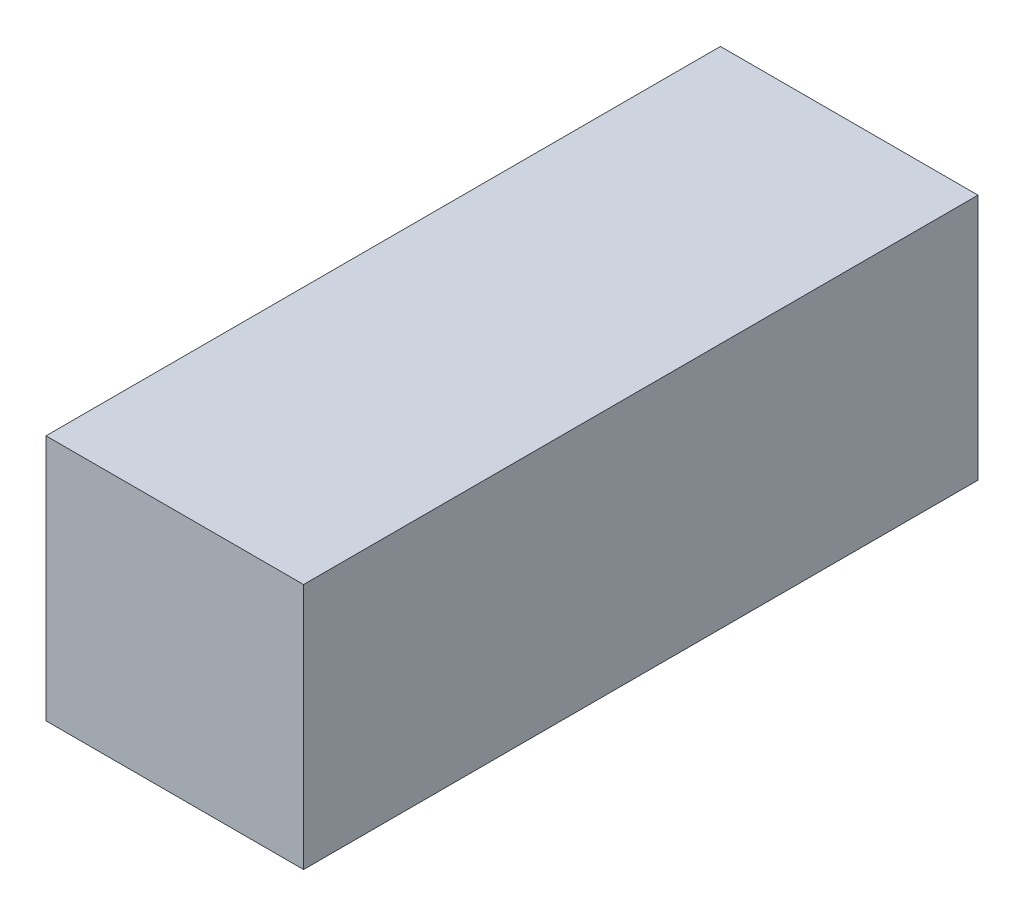
ISO-10303-21;
HEADER;
FILE_DESCRIPTION(('STEP AP214'),'2;1');
FILE_NAME('part.step','',(''),(''),'','','');
FILE_SCHEMA(('AUTOMOTIVE_DESIGN { 1 0 10303 214 1 1 1 1 }'));
ENDSEC;
DATA;
#1=APPLICATION_CONTEXT('core data for automotive mechanical design processes');
#2=APPLICATION_PROTOCOL_DEFINITION('international standard','automotive_design',2000,#1);
#3=PRODUCT_CONTEXT('',#1,'mechanical');
#4=PRODUCT('Part','Part','',(#3));
#5=PRODUCT_RELATED_PRODUCT_CATEGORY('part','',(#4));
#6=PRODUCT_DEFINITION_FORMATION('','',#4);
#7=PRODUCT_DEFINITION_CONTEXT('part definition',#1,'design');
#8=PRODUCT_DEFINITION('design','',#6,#7);
#9=PRODUCT_DEFINITION_SHAPE('','',#8);
#10=(LENGTH_UNIT() NAMED_UNIT(*) SI_UNIT(.MILLI.,.METRE.));
#11=(NAMED_UNIT(*) PLANE_ANGLE_UNIT() SI_UNIT($,.RADIAN.));
#12=(NAMED_UNIT(*) SI_UNIT($,.STERADIAN.) SOLID_ANGLE_UNIT());
#13=UNCERTAINTY_MEASURE_WITH_UNIT(LENGTH_MEASURE(1.E-05),#10,'distance_accuracy_value','');
#14=(GEOMETRIC_REPRESENTATION_CONTEXT(3) GLOBAL_UNCERTAINTY_ASSIGNED_CONTEXT((#13)) GLOBAL_UNIT_ASSIGNED_CONTEXT((#10,
#11,#12)) REPRESENTATION_CONTEXT('',''));
#15=CARTESIAN_POINT('',(0.,0.,0.));
#16=DIRECTION('',(0.,0.,1.));
#17=DIRECTION('',(1.,0.,0.));
#18=AXIS2_PLACEMENT_3D('',#15,#16,#17);
#19=CARTESIAN_POINT('',(1.212632322,-1.162130645,6.35));
#20=DIRECTION('',(-1.,0.,0.));
#21=DIRECTION('',(0.,0.,1.));
#22=AXIS2_PLACEMENT_3D('',#19,#20,#21);
#23=PLANE('',#22);
#24=DIRECTION('',(0.,1.,0.));
#25=VECTOR('',#24,1.);
#26=CARTESIAN_POINT('',(1.212632322,-1.162130645,0.));
#27=LINE('',#26,#25);
#28=CARTESIAN_POINT('',(1.212632322,-1.162130645,0.));
#29=VERTEX_POINT('',#28);
#30=CARTESIAN_POINT('',(1.212632322,1.162130645,0.));
#31=VERTEX_POINT('',#30);
#32=EDGE_CURVE('E94',#29,#31,#27,.T.);
#33=ORIENTED_EDGE('',*,*,#32,.T.);
#34=DIRECTION('',(0.,0.,-1.));
#35=VECTOR('',#34,1.);
#36=CARTESIAN_POINT('',(1.212632322,1.162130645,6.35));
#37=LINE('',#36,#35);
#38=CARTESIAN_POINT('',(1.212632322,1.162130645,6.35));
#39=VERTEX_POINT('',#38);
#40=EDGE_CURVE('E11',#39,#31,#37,.T.);
#41=ORIENTED_EDGE('',*,*,#40,.F.);
#42=DIRECTION('',(0.,1.,0.));
#43=VECTOR('',#42,1.);
#44=CARTESIAN_POINT('',(1.212632322,-1.162130645,6.35));
#45=LINE('',#44,#43);
#46=CARTESIAN_POINT('',(1.212632322,-1.162130645,6.35));
#47=VERTEX_POINT('',#46);
#48=EDGE_CURVE('E82',#47,#39,#45,.T.);
#49=ORIENTED_EDGE('',*,*,#48,.F.);
#50=DIRECTION('',(0.,0.,-1.));
#51=VECTOR('',#50,1.);
#52=CARTESIAN_POINT('',(1.212632322,-1.162130645,6.35));
#53=LINE('',#52,#51);
#54=EDGE_CURVE('E90',#47,#29,#53,.T.);
#55=ORIENTED_EDGE('',*,*,#54,.T.);
#56=EDGE_LOOP('',(#33,#41,#49,#55));
#57=FACE_BOUND('',#56,.T.);
#58=ADVANCED_FACE('F31',(#57),#23,.F.);
#59=CARTESIAN_POINT('',(-1.212632322,1.162130645,6.35));
#60=DIRECTION('',(0.,-1.,0.));
#61=DIRECTION('',(0.,0.,-1.));
#62=AXIS2_PLACEMENT_3D('',#59,#60,#61);
#63=PLANE('',#62);
#64=DIRECTION('',(-1.,0.,0.));
#65=VECTOR('',#64,1.);
#66=CARTESIAN_POINT('',(-1.212632322,1.162130645,0.));
#67=LINE('',#66,#65);
#68=CARTESIAN_POINT('',(-1.212632322,1.162130645,0.));
#69=VERTEX_POINT('',#68);
#70=EDGE_CURVE('E86',#31,#69,#67,.T.);
#71=ORIENTED_EDGE('',*,*,#70,.T.);
#72=DIRECTION('',(0.,0.,-1.));
#73=VECTOR('',#72,1.);
#74=CARTESIAN_POINT('',(-1.212632322,1.162130645,6.35));
#75=LINE('',#74,#73);
#76=CARTESIAN_POINT('',(-1.212632322,1.162130645,6.35));
#77=VERTEX_POINT('',#76);
#78=EDGE_CURVE('E39',#77,#69,#75,.T.);
#79=ORIENTED_EDGE('',*,*,#78,.F.);
#80=DIRECTION('',(-1.,0.,0.));
#81=VECTOR('',#80,1.);
#82=CARTESIAN_POINT('',(-1.212632322,1.162130645,6.35));
#83=LINE('',#82,#81);
#84=EDGE_CURVE('E77',#39,#77,#83,.T.);
#85=ORIENTED_EDGE('',*,*,#84,.F.);
#86=ORIENTED_EDGE('',*,*,#40,.T.);
#87=EDGE_LOOP('',(#71,#79,#85,#86));
#88=FACE_BOUND('',#87,.T.);
#89=ADVANCED_FACE('F85',(#88),#63,.F.);
#90=CARTESIAN_POINT('',(-1.212632322,-1.162130645,6.35));
#91=DIRECTION('',(1.,0.,0.));
#92=DIRECTION('',(0.,0.,-1.));
#93=AXIS2_PLACEMENT_3D('',#90,#91,#92);
#94=PLANE('',#93);
#95=DIRECTION('',(0.,-1.,0.));
#96=VECTOR('',#95,1.);
#97=CARTESIAN_POINT('',(-1.212632322,-1.162130645,0.));
#98=LINE('',#97,#96);
#99=CARTESIAN_POINT('',(-1.212632322,-1.162130645,0.));
#100=VERTEX_POINT('',#99);
#101=EDGE_CURVE('E64',#69,#100,#98,.T.);
#102=ORIENTED_EDGE('',*,*,#101,.T.);
#103=DIRECTION('',(0.,0.,-1.));
#104=VECTOR('',#103,1.);
#105=CARTESIAN_POINT('',(-1.212632322,-1.162130645,6.35));
#106=LINE('',#105,#104);
#107=CARTESIAN_POINT('',(-1.212632322,-1.162130645,6.35));
#108=VERTEX_POINT('',#107);
#109=EDGE_CURVE('E87',#108,#100,#106,.T.);
#110=ORIENTED_EDGE('',*,*,#109,.F.);
#111=DIRECTION('',(0.,-1.,0.));
#112=VECTOR('',#111,1.);
#113=CARTESIAN_POINT('',(-1.212632322,-1.162130645,6.35));
#114=LINE('',#113,#112);
#115=EDGE_CURVE('E80',#77,#108,#114,.T.);
#116=ORIENTED_EDGE('',*,*,#115,.F.);
#117=ORIENTED_EDGE('',*,*,#78,.T.);
#118=EDGE_LOOP('',(#102,#110,#116,#117));
#119=FACE_BOUND('',#118,.T.);
#120=ADVANCED_FACE('F88',(#119),#94,.F.);
#121=CARTESIAN_POINT('',(-1.212632322,-1.162130645,6.35));
#122=DIRECTION('',(0.,1.,0.));
#123=DIRECTION('',(0.,0.,1.));
#124=AXIS2_PLACEMENT_3D('',#121,#122,#123);
#125=PLANE('',#124);
#126=DIRECTION('',(1.,0.,0.));
#127=VECTOR('',#126,1.);
#128=CARTESIAN_POINT('',(-1.212632322,-1.162130645,0.));
#129=LINE('',#128,#127);
#130=EDGE_CURVE('E70',#100,#29,#129,.T.);
#131=ORIENTED_EDGE('',*,*,#130,.T.);
#132=ORIENTED_EDGE('',*,*,#54,.F.);
#133=DIRECTION('',(1.,0.,0.));
#134=VECTOR('',#133,1.);
#135=CARTESIAN_POINT('',(-1.212632322,-1.162130645,6.35));
#136=LINE('',#135,#134);
#137=EDGE_CURVE('E47',#108,#47,#136,.T.);
#138=ORIENTED_EDGE('',*,*,#137,.F.);
#139=ORIENTED_EDGE('',*,*,#109,.T.);
#140=EDGE_LOOP('',(#131,#132,#138,#139));
#141=FACE_BOUND('',#140,.T.);
#142=ADVANCED_FACE('F101',(#141),#125,.F.);
#143=CARTESIAN_POINT('',(1.212632322,1.162130645,6.35));
#144=DIRECTION('',(0.,0.,-1.));
#145=DIRECTION('',(-1.,0.,0.));
#146=AXIS2_PLACEMENT_3D('',#143,#144,#145);
#147=PLANE('',#146);
#148=ORIENTED_EDGE('',*,*,#48,.T.);
#149=ORIENTED_EDGE('',*,*,#84,.T.);
#150=ORIENTED_EDGE('',*,*,#115,.T.);
#151=ORIENTED_EDGE('',*,*,#137,.T.);
#152=EDGE_LOOP('',(#148,#149,#150,#151));
#153=FACE_BOUND('',#152,.T.);
#154=ADVANCED_FACE('F78',(#153),#147,.F.);
#155=CARTESIAN_POINT('',(1.212632322,1.162130645,0.));
#156=DIRECTION('',(0.,0.,-1.));
#157=DIRECTION('',(-1.,0.,0.));
#158=AXIS2_PLACEMENT_3D('',#155,#156,#157);
#159=PLANE('',#158);
#160=ORIENTED_EDGE('',*,*,#32,.F.);
#161=ORIENTED_EDGE('',*,*,#130,.F.);
#162=ORIENTED_EDGE('',*,*,#101,.F.);
#163=ORIENTED_EDGE('',*,*,#70,.F.);
#164=EDGE_LOOP('',(#160,#161,#162,#163));
#165=FACE_BOUND('',#164,.T.);
#166=ADVANCED_FACE('F104',(#165),#159,.T.);
#167=CLOSED_SHELL('',(#58,#89,#120,#142,#154,#166));
#168=MANIFOLD_SOLID_BREP('B2',#167);
#169=ADVANCED_BREP_SHAPE_REPRESENTATION('',(#18,#168),#14);
#170=SHAPE_DEFINITION_REPRESENTATION(#9,#169);
ENDSEC;
END-ISO-10303-21;
